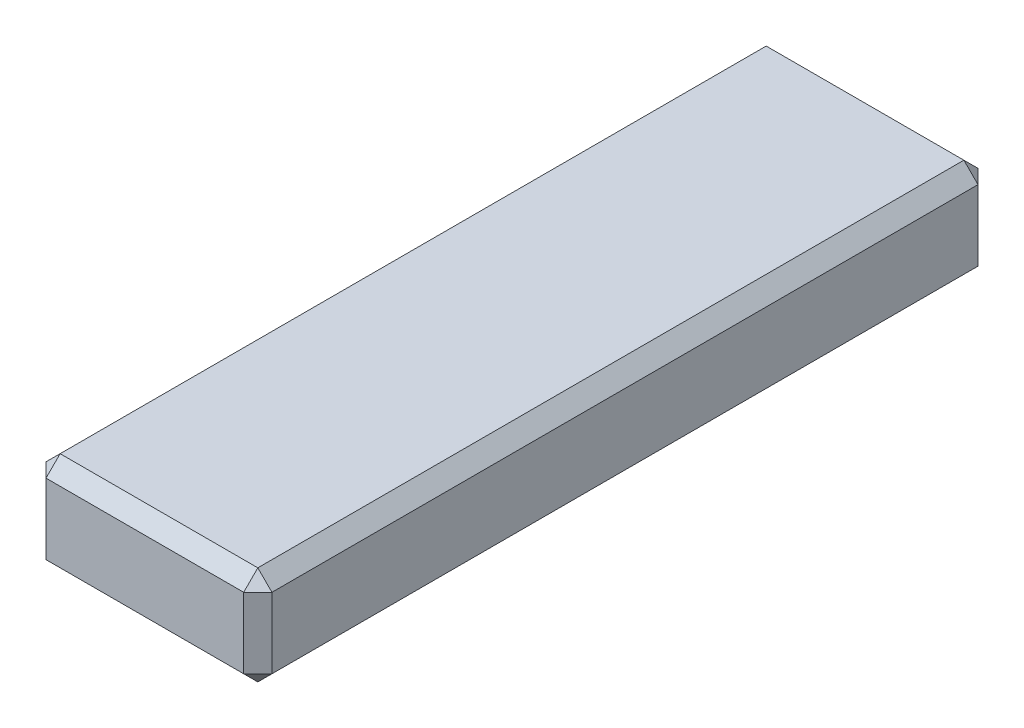
ISO-10303-21;
HEADER;
FILE_DESCRIPTION(('STEP AP214'),'2;1');
FILE_NAME('part.step','',(''),(''),'','','');
FILE_SCHEMA(('AUTOMOTIVE_DESIGN { 1 0 10303 214 1 1 1 1 }'));
ENDSEC;
DATA;
#1=APPLICATION_CONTEXT('core data for automotive mechanical design processes');
#2=APPLICATION_PROTOCOL_DEFINITION('international standard','automotive_design',2000,#1);
#3=PRODUCT_CONTEXT('',#1,'mechanical');
#4=PRODUCT('Part','Part','',(#3));
#5=PRODUCT_RELATED_PRODUCT_CATEGORY('part','',(#4));
#6=PRODUCT_DEFINITION_FORMATION('','',#4);
#7=PRODUCT_DEFINITION_CONTEXT('part definition',#1,'design');
#8=PRODUCT_DEFINITION('design','',#6,#7);
#9=PRODUCT_DEFINITION_SHAPE('','',#8);
#10=(LENGTH_UNIT() NAMED_UNIT(*) SI_UNIT(.MILLI.,.METRE.));
#11=(NAMED_UNIT(*) PLANE_ANGLE_UNIT() SI_UNIT($,.RADIAN.));
#12=(NAMED_UNIT(*) SI_UNIT($,.STERADIAN.) SOLID_ANGLE_UNIT());
#13=UNCERTAINTY_MEASURE_WITH_UNIT(LENGTH_MEASURE(1.E-05),#10,'distance_accuracy_value','');
#14=(GEOMETRIC_REPRESENTATION_CONTEXT(3) GLOBAL_UNCERTAINTY_ASSIGNED_CONTEXT((#13)) GLOBAL_UNIT_ASSIGNED_CONTEXT((#10,
#11,#12)) REPRESENTATION_CONTEXT('',''));
#15=CARTESIAN_POINT('',(0.,0.,0.));
#16=DIRECTION('',(0.,0.,1.));
#17=DIRECTION('',(1.,0.,0.));
#18=AXIS2_PLACEMENT_3D('',#15,#16,#17);
#19=CARTESIAN_POINT('',(4.,1.75,5.));
#20=DIRECTION('',(-1.,0.,0.));
#21=DIRECTION('',(0.,0.,1.));
#22=AXIS2_PLACEMENT_3D('',#19,#20,#21);
#23=PLANE('',#22);
#24=DIRECTION('',(0.,1.,0.));
#25=VECTOR('',#24,1.);
#26=CARTESIAN_POINT('',(4.,1.75,-12.5));
#27=LINE('',#26,#25);
#28=CARTESIAN_POINT('',(4.,-1.25,-12.5));
#29=VERTEX_POINT('',#28);
#30=CARTESIAN_POINT('',(4.,1.25,-12.5));
#31=VERTEX_POINT('',#30);
#32=EDGE_CURVE('E162',#29,#31,#27,.T.);
#33=ORIENTED_EDGE('',*,*,#32,.T.);
#34=DIRECTION('',(0.,0.,1.));
#35=VECTOR('',#34,1.);
#36=CARTESIAN_POINT('',(4.,1.25,5.));
#37=LINE('',#36,#35);
#38=CARTESIAN_POINT('',(4.,1.25,12.5));
#39=VERTEX_POINT('',#38);
#40=EDGE_CURVE('E165',#31,#39,#37,.T.);
#41=ORIENTED_EDGE('',*,*,#40,.T.);
#42=DIRECTION('',(0.,-1.,0.));
#43=VECTOR('',#42,1.);
#44=CARTESIAN_POINT('',(4.,-1.75,12.5));
#45=LINE('',#44,#43);
#46=CARTESIAN_POINT('',(4.,-1.25,12.5));
#47=VERTEX_POINT('',#46);
#48=EDGE_CURVE('E138',#39,#47,#45,.T.);
#49=ORIENTED_EDGE('',*,*,#48,.T.);
#50=DIRECTION('',(0.,0.,-1.));
#51=VECTOR('',#50,1.);
#52=CARTESIAN_POINT('',(4.,-1.25,5.));
#53=LINE('',#52,#51);
#54=EDGE_CURVE('E156',#47,#29,#53,.T.);
#55=ORIENTED_EDGE('',*,*,#54,.T.);
#56=EDGE_LOOP('',(#33,#41,#49,#55));
#57=FACE_BOUND('',#56,.T.);
#58=ADVANCED_FACE('F43',(#57),#23,.F.);
#59=CARTESIAN_POINT('',(-4.,1.75,5.));
#60=DIRECTION('',(0.,-1.,0.));
#61=DIRECTION('',(0.,0.,-1.));
#62=AXIS2_PLACEMENT_3D('',#59,#60,#61);
#63=PLANE('',#62);
#64=DIRECTION('',(0.,0.,1.));
#65=VECTOR('',#64,1.);
#66=CARTESIAN_POINT('',(-3.49999999999999,1.75,5.));
#67=LINE('',#66,#65);
#68=CARTESIAN_POINT('',(-3.49999999999999,1.75,-12.5));
#69=VERTEX_POINT('',#68);
#70=CARTESIAN_POINT('',(-3.49999999999999,1.75,12.5));
#71=VERTEX_POINT('',#70);
#72=EDGE_CURVE('E187',#69,#71,#67,.T.);
#73=ORIENTED_EDGE('',*,*,#72,.T.);
#74=DIRECTION('',(1.,0.,0.));
#75=VECTOR('',#74,1.);
#76=CARTESIAN_POINT('',(4.,1.75,12.5));
#77=LINE('',#76,#75);
#78=CARTESIAN_POINT('',(3.49999999999999,1.75,12.5));
#79=VERTEX_POINT('',#78);
#80=EDGE_CURVE('E193',#71,#79,#77,.T.);
#81=ORIENTED_EDGE('',*,*,#80,.T.);
#82=DIRECTION('',(0.,0.,-1.));
#83=VECTOR('',#82,1.);
#84=CARTESIAN_POINT('',(3.49999999999999,1.75,5.));
#85=LINE('',#84,#83);
#86=CARTESIAN_POINT('',(3.49999999999999,1.75,-12.5));
#87=VERTEX_POINT('',#86);
#88=EDGE_CURVE('E191',#79,#87,#85,.T.);
#89=ORIENTED_EDGE('',*,*,#88,.T.);
#90=DIRECTION('',(-1.,0.,0.));
#91=VECTOR('',#90,1.);
#92=CARTESIAN_POINT('',(-4.,1.75,-12.5));
#93=LINE('',#92,#91);
#94=EDGE_CURVE('E189',#87,#69,#93,.T.);
#95=ORIENTED_EDGE('',*,*,#94,.T.);
#96=EDGE_LOOP('',(#73,#81,#89,#95));
#97=FACE_BOUND('',#96,.T.);
#98=ADVANCED_FACE('F278',(#97),#63,.F.);
#99=CARTESIAN_POINT('',(-4.,1.75,5.));
#100=DIRECTION('',(1.,0.,0.));
#101=DIRECTION('',(0.,0.,-1.));
#102=AXIS2_PLACEMENT_3D('',#99,#100,#101);
#103=PLANE('',#102);
#104=DIRECTION('',(0.,0.,1.));
#105=VECTOR('',#104,1.);
#106=CARTESIAN_POINT('',(-4.,-1.25,5.));
#107=LINE('',#106,#105);
#108=CARTESIAN_POINT('',(-4.,-1.25,-12.5));
#109=VERTEX_POINT('',#108);
#110=CARTESIAN_POINT('',(-4.,-1.25,12.5));
#111=VERTEX_POINT('',#110);
#112=EDGE_CURVE('E53',#109,#111,#107,.T.);
#113=ORIENTED_EDGE('',*,*,#112,.T.);
#114=DIRECTION('',(0.,1.,0.));
#115=VECTOR('',#114,1.);
#116=CARTESIAN_POINT('',(-4.,1.75,12.5));
#117=LINE('',#116,#115);
#118=CARTESIAN_POINT('',(-4.,1.25,12.5));
#119=VERTEX_POINT('',#118);
#120=EDGE_CURVE('E11',#111,#119,#117,.T.);
#121=ORIENTED_EDGE('',*,*,#120,.T.);
#122=DIRECTION('',(0.,0.,-1.));
#123=VECTOR('',#122,1.);
#124=CARTESIAN_POINT('',(-4.,1.25,5.));
#125=LINE('',#124,#123);
#126=CARTESIAN_POINT('',(-4.,1.25,-12.5));
#127=VERTEX_POINT('',#126);
#128=EDGE_CURVE('E205',#119,#127,#125,.T.);
#129=ORIENTED_EDGE('',*,*,#128,.T.);
#130=DIRECTION('',(0.,-1.,0.));
#131=VECTOR('',#130,1.);
#132=CARTESIAN_POINT('',(-4.,-1.75,-12.5));
#133=LINE('',#132,#131);
#134=EDGE_CURVE('E64',#127,#109,#133,.T.);
#135=ORIENTED_EDGE('',*,*,#134,.T.);
#136=EDGE_LOOP('',(#113,#121,#129,#135));
#137=FACE_BOUND('',#136,.T.);
#138=ADVANCED_FACE('F313',(#137),#103,.F.);
#139=CARTESIAN_POINT('',(-4.,-1.75,5.));
#140=DIRECTION('',(0.,1.,0.));
#141=DIRECTION('',(0.,0.,1.));
#142=AXIS2_PLACEMENT_3D('',#139,#140,#141);
#143=PLANE('',#142);
#144=DIRECTION('',(0.,0.,1.));
#145=VECTOR('',#144,1.);
#146=CARTESIAN_POINT('',(3.49999999999999,-1.75,5.));
#147=LINE('',#146,#145);
#148=CARTESIAN_POINT('',(3.49999999999999,-1.75,-12.5));
#149=VERTEX_POINT('',#148);
#150=CARTESIAN_POINT('',(3.49999999999999,-1.75,12.5));
#151=VERTEX_POINT('',#150);
#152=EDGE_CURVE('E200',#149,#151,#147,.T.);
#153=ORIENTED_EDGE('',*,*,#152,.T.);
#154=DIRECTION('',(-1.,0.,0.));
#155=VECTOR('',#154,1.);
#156=CARTESIAN_POINT('',(-4.,-1.75,12.5));
#157=LINE('',#156,#155);
#158=CARTESIAN_POINT('',(-3.49999999999999,-1.75,12.5));
#159=VERTEX_POINT('',#158);
#160=EDGE_CURVE('E202',#151,#159,#157,.T.);
#161=ORIENTED_EDGE('',*,*,#160,.T.);
#162=DIRECTION('',(0.,0.,-1.));
#163=VECTOR('',#162,1.);
#164=CARTESIAN_POINT('',(-3.49999999999999,-1.75,5.));
#165=LINE('',#164,#163);
#166=CARTESIAN_POINT('',(-3.49999999999999,-1.75,-12.5));
#167=VERTEX_POINT('',#166);
#168=EDGE_CURVE('E196',#159,#167,#165,.T.);
#169=ORIENTED_EDGE('',*,*,#168,.T.);
#170=DIRECTION('',(1.,0.,0.));
#171=VECTOR('',#170,1.);
#172=CARTESIAN_POINT('',(4.,-1.75,-12.5));
#173=LINE('',#172,#171);
#174=EDGE_CURVE('E198',#167,#149,#173,.T.);
#175=ORIENTED_EDGE('',*,*,#174,.T.);
#176=EDGE_LOOP('',(#153,#161,#169,#175));
#177=FACE_BOUND('',#176,.T.);
#178=ADVANCED_FACE('F315',(#177),#143,.F.);
#179=CARTESIAN_POINT('',(0.,0.,-13.));
#180=DIRECTION('',(0.,0.,-1.));
#181=DIRECTION('',(-1.,0.,0.));
#182=AXIS2_PLACEMENT_3D('',#179,#180,#181);
#183=PLANE('',#182);
#184=DIRECTION('',(1.,0.,0.));
#185=VECTOR('',#184,1.);
#186=CARTESIAN_POINT('',(4.,1.25,-13.));
#187=LINE('',#186,#185);
#188=CARTESIAN_POINT('',(-3.49999999999999,1.25,-13.));
#189=VERTEX_POINT('',#188);
#190=CARTESIAN_POINT('',(3.5,1.25,-13.));
#191=VERTEX_POINT('',#190);
#192=EDGE_CURVE('E182',#189,#191,#187,.T.);
#193=ORIENTED_EDGE('',*,*,#192,.T.);
#194=DIRECTION('',(0.,-1.,0.));
#195=VECTOR('',#194,1.);
#196=CARTESIAN_POINT('',(3.5,-1.75,-13.));
#197=LINE('',#196,#195);
#198=CARTESIAN_POINT('',(3.5,-1.25,-13.));
#199=VERTEX_POINT('',#198);
#200=EDGE_CURVE('E184',#191,#199,#197,.T.);
#201=ORIENTED_EDGE('',*,*,#200,.T.);
#202=DIRECTION('',(-1.,0.,0.));
#203=VECTOR('',#202,1.);
#204=CARTESIAN_POINT('',(-4.,-1.25,-13.));
#205=LINE('',#204,#203);
#206=CARTESIAN_POINT('',(-3.49999999999999,-1.25,-13.));
#207=VERTEX_POINT('',#206);
#208=EDGE_CURVE('E180',#199,#207,#205,.T.);
#209=ORIENTED_EDGE('',*,*,#208,.T.);
#210=DIRECTION('',(0.,1.,0.));
#211=VECTOR('',#210,1.);
#212=CARTESIAN_POINT('',(-3.49999999999999,1.75,-13.));
#213=LINE('',#212,#211);
#214=EDGE_CURVE('E178',#207,#189,#213,.T.);
#215=ORIENTED_EDGE('',*,*,#214,.T.);
#216=EDGE_LOOP('',(#193,#201,#209,#215));
#217=FACE_BOUND('',#216,.T.);
#218=ADVANCED_FACE('F287',(#217),#183,.T.);
#219=CARTESIAN_POINT('',(0.,0.,13.));
#220=DIRECTION('',(0.,0.,1.));
#221=DIRECTION('',(-1.,0.,0.));
#222=AXIS2_PLACEMENT_3D('',#219,#220,#221);
#223=PLANE('',#222);
#224=DIRECTION('',(1.,0.,0.));
#225=VECTOR('',#224,1.);
#226=CARTESIAN_POINT('',(4.,-1.24999999999999,13.));
#227=LINE('',#226,#225);
#228=CARTESIAN_POINT('',(-3.49999999999999,-1.24999999999999,13.));
#229=VERTEX_POINT('',#228);
#230=CARTESIAN_POINT('',(3.49999999999999,-1.24999999999999,13.));
#231=VERTEX_POINT('',#230);
#232=EDGE_CURVE('E173',#229,#231,#227,.T.);
#233=ORIENTED_EDGE('',*,*,#232,.T.);
#234=DIRECTION('',(0.,1.,0.));
#235=VECTOR('',#234,1.);
#236=CARTESIAN_POINT('',(3.49999999999999,1.75,13.));
#237=LINE('',#236,#235);
#238=CARTESIAN_POINT('',(3.49999999999999,1.25,13.));
#239=VERTEX_POINT('',#238);
#240=EDGE_CURVE('E140',#231,#239,#237,.T.);
#241=ORIENTED_EDGE('',*,*,#240,.T.);
#242=DIRECTION('',(-1.,0.,0.));
#243=VECTOR('',#242,1.);
#244=CARTESIAN_POINT('',(-4.,1.25,13.));
#245=LINE('',#244,#243);
#246=CARTESIAN_POINT('',(-3.49999999999999,1.25,13.));
#247=VERTEX_POINT('',#246);
#248=EDGE_CURVE('E175',#239,#247,#245,.T.);
#249=ORIENTED_EDGE('',*,*,#248,.T.);
#250=DIRECTION('',(0.,-1.,0.));
#251=VECTOR('',#250,1.);
#252=CARTESIAN_POINT('',(-3.49999999999999,-1.75,13.));
#253=LINE('',#252,#251);
#254=EDGE_CURVE('E168',#247,#229,#253,.T.);
#255=ORIENTED_EDGE('',*,*,#254,.T.);
#256=EDGE_LOOP('',(#233,#241,#249,#255));
#257=FACE_BOUND('',#256,.T.);
#258=ADVANCED_FACE('F438',(#257),#223,.T.);
#259=CARTESIAN_POINT('',(-3.49999999999999,0.,-13.));
#260=DIRECTION('',(-0.707106781186545,0.,-0.70710678118655));
#261=DIRECTION('',(0.,-1.,0.));
#262=AXIS2_PLACEMENT_3D('',#259,#260,#261);
#263=PLANE('',#262);
#264=DIRECTION('',(-0.70710678118655,0.,0.707106781186545));
#265=VECTOR('',#264,1.);
#266=CARTESIAN_POINT('',(-3.75,1.25,-12.75));
#267=LINE('',#266,#265);
#268=EDGE_CURVE('E48',#189,#127,#267,.T.);
#269=ORIENTED_EDGE('',*,*,#268,.F.);
#270=ORIENTED_EDGE('',*,*,#214,.F.);
#271=DIRECTION('',(0.70710678118655,0.,-0.707106781186545));
#272=VECTOR('',#271,1.);
#273=CARTESIAN_POINT('',(-3.49999999999999,-1.25,-13.));
#274=LINE('',#273,#272);
#275=EDGE_CURVE('E257',#109,#207,#274,.T.);
#276=ORIENTED_EDGE('',*,*,#275,.F.);
#277=ORIENTED_EDGE('',*,*,#134,.F.);
#278=EDGE_LOOP('',(#269,#270,#276,#277));
#279=FACE_BOUND('',#278,.T.);
#280=ADVANCED_FACE('F46',(#279),#263,.T.);
#281=CARTESIAN_POINT('',(-3.49999999999999,1.75,-12.5));
#282=DIRECTION('',(-0.577350269189622,0.57735026918963,-0.577350269189626));
#283=DIRECTION('',(0.,0.707106781186545,0.70710678118655));
#284=AXIS2_PLACEMENT_3D('',#281,#282,#283);
#285=PLANE('',#284);
#286=DIRECTION('',(0.,-0.707106781186545,-0.70710678118655));
#287=VECTOR('',#286,1.);
#288=CARTESIAN_POINT('',(-3.49999999999999,1.75,-12.5));
#289=LINE('',#288,#287);
#290=EDGE_CURVE('E252',#189,#69,#289,.F.);
#291=ORIENTED_EDGE('',*,*,#290,.F.);
#292=ORIENTED_EDGE('',*,*,#268,.T.);
#293=DIRECTION('',(-0.70710678118655,-0.707106781186545,0.));
#294=VECTOR('',#293,1.);
#295=CARTESIAN_POINT('',(-3.49999999999999,1.75,-12.5));
#296=LINE('',#295,#294);
#297=EDGE_CURVE('E255',#69,#127,#296,.T.);
#298=ORIENTED_EDGE('',*,*,#297,.F.);
#299=EDGE_LOOP('',(#291,#292,#298));
#300=FACE_BOUND('',#299,.T.);
#301=ADVANCED_FACE('F267',(#300),#285,.T.);
#302=CARTESIAN_POINT('',(-3.49999999999999,-1.25,-13.));
#303=DIRECTION('',(-0.577350269189622,-0.57735026918963,-0.577350269189626));
#304=DIRECTION('',(0.,0.707106781186545,-0.70710678118655));
#305=AXIS2_PLACEMENT_3D('',#302,#303,#304);
#306=PLANE('',#305);
#307=DIRECTION('',(0.70710678118655,-0.707106781186545,0.));
#308=VECTOR('',#307,1.);
#309=CARTESIAN_POINT('',(-3.75,-1.5,-12.5));
#310=LINE('',#309,#308);
#311=EDGE_CURVE('E246',#109,#167,#310,.T.);
#312=ORIENTED_EDGE('',*,*,#311,.F.);
#313=ORIENTED_EDGE('',*,*,#275,.T.);
#314=DIRECTION('',(0.,-0.707106781186545,0.70710678118655));
#315=VECTOR('',#314,1.);
#316=CARTESIAN_POINT('',(-3.49999999999999,-1.25,-13.));
#317=LINE('',#316,#315);
#318=EDGE_CURVE('E249',#167,#207,#317,.F.);
#319=ORIENTED_EDGE('',*,*,#318,.F.);
#320=EDGE_LOOP('',(#312,#313,#319));
#321=FACE_BOUND('',#320,.T.);
#322=ADVANCED_FACE('F299',(#321),#306,.T.);
#323=CARTESIAN_POINT('',(-4.,1.25,5.));
#324=DIRECTION('',(0.707106781186545,-0.70710678118655,0.));
#325=DIRECTION('',(0.,0.,-1.));
#326=AXIS2_PLACEMENT_3D('',#323,#324,#325);
#327=PLANE('',#326);
#328=ORIENTED_EDGE('',*,*,#297,.T.);
#329=ORIENTED_EDGE('',*,*,#128,.F.);
#330=DIRECTION('',(0.70710678118655,0.707106781186545,0.));
#331=VECTOR('',#330,1.);
#332=CARTESIAN_POINT('',(-3.75,1.5,12.5));
#333=LINE('',#332,#331);
#334=EDGE_CURVE('E241',#71,#119,#333,.F.);
#335=ORIENTED_EDGE('',*,*,#334,.F.);
#336=ORIENTED_EDGE('',*,*,#72,.F.);
#337=EDGE_LOOP('',(#328,#329,#335,#336));
#338=FACE_BOUND('',#337,.T.);
#339=ADVANCED_FACE('F274',(#338),#327,.F.);
#340=CARTESIAN_POINT('',(0.,1.25,-13.));
#341=DIRECTION('',(0.,0.70710678118655,-0.707106781186545));
#342=DIRECTION('',(-1.,0.,0.));
#343=AXIS2_PLACEMENT_3D('',#340,#341,#342);
#344=PLANE('',#343);
#345=ORIENTED_EDGE('',*,*,#290,.T.);
#346=ORIENTED_EDGE('',*,*,#94,.F.);
#347=DIRECTION('',(0.,0.707106781186545,0.70710678118655));
#348=VECTOR('',#347,1.);
#349=CARTESIAN_POINT('',(3.49999999999999,1.5,-12.75));
#350=LINE('',#349,#348);
#351=EDGE_CURVE('E238',#191,#87,#350,.T.);
#352=ORIENTED_EDGE('',*,*,#351,.F.);
#353=ORIENTED_EDGE('',*,*,#192,.F.);
#354=EDGE_LOOP('',(#345,#346,#352,#353));
#355=FACE_BOUND('',#354,.T.);
#356=ADVANCED_FACE('F284',(#355),#344,.T.);
#357=CARTESIAN_POINT('',(3.5,0.,-13.));
#358=DIRECTION('',(0.70710678118655,0.,-0.707106781186545));
#359=DIRECTION('',(0.,1.,0.));
#360=AXIS2_PLACEMENT_3D('',#357,#358,#359);
#361=PLANE('',#360);
#362=DIRECTION('',(0.707106781186545,0.,0.70710678118655));
#363=VECTOR('',#362,1.);
#364=CARTESIAN_POINT('',(3.5,-1.25,-13.));
#365=LINE('',#364,#363);
#366=EDGE_CURVE('E232',#199,#29,#365,.T.);
#367=ORIENTED_EDGE('',*,*,#366,.F.);
#368=ORIENTED_EDGE('',*,*,#200,.F.);
#369=DIRECTION('',(-0.707106781186545,0.,-0.70710678118655));
#370=VECTOR('',#369,1.);
#371=CARTESIAN_POINT('',(4.,1.25,-12.5));
#372=LINE('',#371,#370);
#373=EDGE_CURVE('E235',#31,#191,#372,.T.);
#374=ORIENTED_EDGE('',*,*,#373,.F.);
#375=ORIENTED_EDGE('',*,*,#32,.F.);
#376=EDGE_LOOP('',(#367,#368,#374,#375));
#377=FACE_BOUND('',#376,.T.);
#378=ADVANCED_FACE('F291',(#377),#361,.T.);
#379=CARTESIAN_POINT('',(0.,-1.25,-13.));
#380=DIRECTION('',(0.,-0.70710678118655,-0.707106781186545));
#381=DIRECTION('',(1.,0.,0.));
#382=AXIS2_PLACEMENT_3D('',#379,#380,#381);
#383=PLANE('',#382);
#384=ORIENTED_EDGE('',*,*,#318,.T.);
#385=ORIENTED_EDGE('',*,*,#208,.F.);
#386=DIRECTION('',(0.,0.707106781186545,-0.70710678118655));
#387=VECTOR('',#386,1.);
#388=CARTESIAN_POINT('',(3.5,-1.25,-13.));
#389=LINE('',#388,#387);
#390=EDGE_CURVE('E230',#149,#199,#389,.T.);
#391=ORIENTED_EDGE('',*,*,#390,.F.);
#392=ORIENTED_EDGE('',*,*,#174,.F.);
#393=EDGE_LOOP('',(#384,#385,#391,#392));
#394=FACE_BOUND('',#393,.T.);
#395=ADVANCED_FACE('F297',(#394),#383,.T.);
#396=CARTESIAN_POINT('',(-3.49999999999999,-1.75,5.));
#397=DIRECTION('',(0.707106781186545,0.70710678118655,0.));
#398=DIRECTION('',(0.,0.,-1.));
#399=AXIS2_PLACEMENT_3D('',#396,#397,#398);
#400=PLANE('',#399);
#401=ORIENTED_EDGE('',*,*,#311,.T.);
#402=ORIENTED_EDGE('',*,*,#168,.F.);
#403=DIRECTION('',(-0.70710678118655,0.707106781186545,0.));
#404=VECTOR('',#403,1.);
#405=CARTESIAN_POINT('',(-3.49999999999999,-1.75,12.5));
#406=LINE('',#405,#404);
#407=EDGE_CURVE('E227',#111,#159,#406,.F.);
#408=ORIENTED_EDGE('',*,*,#407,.F.);
#409=ORIENTED_EDGE('',*,*,#112,.F.);
#410=EDGE_LOOP('',(#401,#402,#408,#409));
#411=FACE_BOUND('',#410,.T.);
#412=ADVANCED_FACE('F303',(#411),#400,.F.);
#413=CARTESIAN_POINT('',(-4.,1.75,12.5));
#414=DIRECTION('',(-0.707106781186545,0.,0.70710678118655));
#415=DIRECTION('',(0.,-1.,0.));
#416=AXIS2_PLACEMENT_3D('',#413,#414,#415);
#417=PLANE('',#416);
#418=DIRECTION('',(0.70710678118655,0.,0.707106781186545));
#419=VECTOR('',#418,1.);
#420=CARTESIAN_POINT('',(-3.49999999999999,1.25,13.));
#421=LINE('',#420,#419);
#422=EDGE_CURVE('E243',#119,#247,#421,.T.);
#423=ORIENTED_EDGE('',*,*,#422,.F.);
#424=ORIENTED_EDGE('',*,*,#120,.F.);
#425=DIRECTION('',(-0.70710678118655,0.,-0.707106781186545));
#426=VECTOR('',#425,1.);
#427=CARTESIAN_POINT('',(-3.75,-1.24999999999999,12.75));
#428=LINE('',#427,#426);
#429=EDGE_CURVE('E224',#229,#111,#428,.T.);
#430=ORIENTED_EDGE('',*,*,#429,.F.);
#431=ORIENTED_EDGE('',*,*,#254,.F.);
#432=EDGE_LOOP('',(#423,#424,#430,#431));
#433=FACE_BOUND('',#432,.T.);
#434=ADVANCED_FACE('F312',(#433),#417,.T.);
#435=CARTESIAN_POINT('',(-3.49999999999999,1.25,13.));
#436=DIRECTION('',(-0.577350269189622,0.57735026918963,0.577350269189626));
#437=DIRECTION('',(0.,-0.707106781186545,0.70710678118655));
#438=AXIS2_PLACEMENT_3D('',#435,#436,#437);
#439=PLANE('',#438);
#440=ORIENTED_EDGE('',*,*,#334,.T.);
#441=ORIENTED_EDGE('',*,*,#422,.T.);
#442=DIRECTION('',(0.,0.707106781186545,-0.70710678118655));
#443=VECTOR('',#442,1.);
#444=CARTESIAN_POINT('',(-3.49999999999999,1.25,13.));
#445=LINE('',#444,#443);
#446=EDGE_CURVE('E221',#71,#247,#445,.F.);
#447=ORIENTED_EDGE('',*,*,#446,.F.);
#448=EDGE_LOOP('',(#440,#441,#447));
#449=FACE_BOUND('',#448,.T.);
#450=ADVANCED_FACE('F390',(#449),#439,.T.);
#451=CARTESIAN_POINT('',(4.,1.25,-12.5));
#452=DIRECTION('',(0.577350269189626,0.57735026918963,-0.577350269189622));
#453=DIRECTION('',(-0.70710678118655,0.707106781186545,0.));
#454=AXIS2_PLACEMENT_3D('',#451,#452,#453);
#455=PLANE('',#454);
#456=ORIENTED_EDGE('',*,*,#373,.T.);
#457=ORIENTED_EDGE('',*,*,#351,.T.);
#458=DIRECTION('',(-0.70710678118655,0.707106781186545,0.));
#459=VECTOR('',#458,1.);
#460=CARTESIAN_POINT('',(4.,1.25,-12.5));
#461=LINE('',#460,#459);
#462=EDGE_CURVE('E218',#31,#87,#461,.T.);
#463=ORIENTED_EDGE('',*,*,#462,.F.);
#464=EDGE_LOOP('',(#456,#457,#463));
#465=FACE_BOUND('',#464,.T.);
#466=ADVANCED_FACE('F384',(#465),#455,.T.);
#467=CARTESIAN_POINT('',(3.5,-1.25,-13.));
#468=DIRECTION('',(0.577350269189626,-0.57735026918963,-0.577350269189622));
#469=DIRECTION('',(0.70710678118655,0.707106781186545,0.));
#470=AXIS2_PLACEMENT_3D('',#467,#468,#469);
#471=PLANE('',#470);
#472=ORIENTED_EDGE('',*,*,#390,.T.);
#473=ORIENTED_EDGE('',*,*,#366,.T.);
#474=DIRECTION('',(0.70710678118655,0.707106781186545,0.));
#475=VECTOR('',#474,1.);
#476=CARTESIAN_POINT('',(3.75,-1.5,-12.5));
#477=LINE('',#476,#475);
#478=EDGE_CURVE('E159',#149,#29,#477,.T.);
#479=ORIENTED_EDGE('',*,*,#478,.F.);
#480=EDGE_LOOP('',(#472,#473,#479));
#481=FACE_BOUND('',#480,.T.);
#482=ADVANCED_FACE('F378',(#481),#471,.T.);
#483=CARTESIAN_POINT('',(-3.49999999999999,-1.75,12.5));
#484=DIRECTION('',(-0.577350269189622,-0.577350269189626,0.57735026918963));
#485=DIRECTION('',(0.,-0.70710678118655,-0.707106781186545));
#486=AXIS2_PLACEMENT_3D('',#483,#484,#485);
#487=PLANE('',#486);
#488=ORIENTED_EDGE('',*,*,#429,.T.);
#489=ORIENTED_EDGE('',*,*,#407,.T.);
#490=DIRECTION('',(0.,0.70710678118655,0.707106781186545));
#491=VECTOR('',#490,1.);
#492=CARTESIAN_POINT('',(-3.49999999999999,-1.75,12.5));
#493=LINE('',#492,#491);
#494=EDGE_CURVE('E215',#229,#159,#493,.F.);
#495=ORIENTED_EDGE('',*,*,#494,.F.);
#496=EDGE_LOOP('',(#488,#489,#495));
#497=FACE_BOUND('',#496,.T.);
#498=ADVANCED_FACE('F307',(#497),#487,.T.);
#499=CARTESIAN_POINT('',(-4.,1.75,12.5));
#500=DIRECTION('',(0.,0.70710678118655,0.707106781186545));
#501=DIRECTION('',(-1.,0.,0.));
#502=AXIS2_PLACEMENT_3D('',#499,#500,#501);
#503=PLANE('',#502);
#504=ORIENTED_EDGE('',*,*,#446,.T.);
#505=ORIENTED_EDGE('',*,*,#248,.F.);
#506=DIRECTION('',(0.,-0.707106781186545,0.70710678118655));
#507=VECTOR('',#506,1.);
#508=CARTESIAN_POINT('',(3.49999999999999,1.25,13.));
#509=LINE('',#508,#507);
#510=EDGE_CURVE('E212',#79,#239,#509,.T.);
#511=ORIENTED_EDGE('',*,*,#510,.F.);
#512=ORIENTED_EDGE('',*,*,#80,.F.);
#513=EDGE_LOOP('',(#504,#505,#511,#512));
#514=FACE_BOUND('',#513,.T.);
#515=ADVANCED_FACE('F365',(#514),#503,.T.);
#516=CARTESIAN_POINT('',(3.49999999999999,1.75,5.));
#517=DIRECTION('',(-0.707106781186545,-0.70710678118655,0.));
#518=DIRECTION('',(0.,0.,-1.));
#519=AXIS2_PLACEMENT_3D('',#516,#517,#518);
#520=PLANE('',#519);
#521=ORIENTED_EDGE('',*,*,#462,.T.);
#522=ORIENTED_EDGE('',*,*,#88,.F.);
#523=DIRECTION('',(0.70710678118655,-0.707106781186545,0.));
#524=VECTOR('',#523,1.);
#525=CARTESIAN_POINT('',(3.75,1.5,12.5));
#526=LINE('',#525,#524);
#527=EDGE_CURVE('E153',#39,#79,#526,.F.);
#528=ORIENTED_EDGE('',*,*,#527,.F.);
#529=ORIENTED_EDGE('',*,*,#40,.F.);
#530=EDGE_LOOP('',(#521,#522,#528,#529));
#531=FACE_BOUND('',#530,.T.);
#532=ADVANCED_FACE('F359',(#531),#520,.F.);
#533=CARTESIAN_POINT('',(4.,-1.25,5.));
#534=DIRECTION('',(-0.707106781186545,0.70710678118655,0.));
#535=DIRECTION('',(0.,0.,-1.));
#536=AXIS2_PLACEMENT_3D('',#533,#534,#535);
#537=PLANE('',#536);
#538=ORIENTED_EDGE('',*,*,#478,.T.);
#539=ORIENTED_EDGE('',*,*,#54,.F.);
#540=DIRECTION('',(-0.70710678118655,-0.707106781186545,0.));
#541=VECTOR('',#540,1.);
#542=CARTESIAN_POINT('',(4.,-1.25,12.5));
#543=LINE('',#542,#541);
#544=EDGE_CURVE('E146',#151,#47,#543,.F.);
#545=ORIENTED_EDGE('',*,*,#544,.F.);
#546=ORIENTED_EDGE('',*,*,#152,.F.);
#547=EDGE_LOOP('',(#538,#539,#545,#546));
#548=FACE_BOUND('',#547,.T.);
#549=ADVANCED_FACE('F157',(#548),#537,.F.);
#550=CARTESIAN_POINT('',(-4.,-1.75,12.5));
#551=DIRECTION('',(0.,-0.707106781186545,0.70710678118655));
#552=DIRECTION('',(1.,0.,0.));
#553=AXIS2_PLACEMENT_3D('',#550,#551,#552);
#554=PLANE('',#553);
#555=ORIENTED_EDGE('',*,*,#494,.T.);
#556=ORIENTED_EDGE('',*,*,#160,.F.);
#557=DIRECTION('',(0.,-0.70710678118655,-0.707106781186545));
#558=VECTOR('',#557,1.);
#559=CARTESIAN_POINT('',(3.49999999999999,-1.5,12.75));
#560=LINE('',#559,#558);
#561=EDGE_CURVE('E150',#231,#151,#560,.T.);
#562=ORIENTED_EDGE('',*,*,#561,.F.);
#563=ORIENTED_EDGE('',*,*,#232,.F.);
#564=EDGE_LOOP('',(#555,#556,#562,#563));
#565=FACE_BOUND('',#564,.T.);
#566=ADVANCED_FACE('F346',(#565),#554,.T.);
#567=CARTESIAN_POINT('',(3.49999999999999,1.25,13.));
#568=DIRECTION('',(0.577350269189622,0.57735026918963,0.577350269189626));
#569=DIRECTION('',(0.,-0.707106781186545,0.70710678118655));
#570=AXIS2_PLACEMENT_3D('',#567,#568,#569);
#571=PLANE('',#570);
#572=ORIENTED_EDGE('',*,*,#527,.T.);
#573=ORIENTED_EDGE('',*,*,#510,.T.);
#574=DIRECTION('',(0.70710678118655,0.,-0.707106781186545));
#575=VECTOR('',#574,1.);
#576=CARTESIAN_POINT('',(3.49999999999999,1.25,13.));
#577=LINE('',#576,#575);
#578=EDGE_CURVE('E143',#39,#239,#577,.F.);
#579=ORIENTED_EDGE('',*,*,#578,.F.);
#580=EDGE_LOOP('',(#572,#573,#579));
#581=FACE_BOUND('',#580,.T.);
#582=ADVANCED_FACE('F340',(#581),#571,.T.);
#583=CARTESIAN_POINT('',(4.,-1.25,12.5));
#584=DIRECTION('',(0.577350269189622,-0.577350269189626,0.57735026918963));
#585=DIRECTION('',(0.,-0.70710678118655,-0.707106781186545));
#586=AXIS2_PLACEMENT_3D('',#583,#584,#585);
#587=PLANE('',#586);
#588=ORIENTED_EDGE('',*,*,#561,.T.);
#589=ORIENTED_EDGE('',*,*,#544,.T.);
#590=DIRECTION('',(-0.70710678118655,0.,0.707106781186545));
#591=VECTOR('',#590,1.);
#592=CARTESIAN_POINT('',(4.,-1.25,12.5));
#593=LINE('',#592,#591);
#594=EDGE_CURVE('E134',#231,#47,#593,.F.);
#595=ORIENTED_EDGE('',*,*,#594,.F.);
#596=EDGE_LOOP('',(#588,#589,#595));
#597=FACE_BOUND('',#596,.T.);
#598=ADVANCED_FACE('F148',(#597),#587,.T.);
#599=CARTESIAN_POINT('',(4.,1.75,12.5));
#600=DIRECTION('',(0.707106781186545,0.,0.70710678118655));
#601=DIRECTION('',(0.,1.,0.));
#602=AXIS2_PLACEMENT_3D('',#599,#600,#601);
#603=PLANE('',#602);
#604=ORIENTED_EDGE('',*,*,#578,.T.);
#605=ORIENTED_EDGE('',*,*,#240,.F.);
#606=ORIENTED_EDGE('',*,*,#594,.T.);
#607=ORIENTED_EDGE('',*,*,#48,.F.);
#608=EDGE_LOOP('',(#604,#605,#606,#607));
#609=FACE_BOUND('',#608,.T.);
#610=ADVANCED_FACE('F136',(#609),#603,.T.);
#611=CLOSED_SHELL('',(#58,#98,#138,#178,#218,#258,#280,#301,#322,#339,#356,#378,#395,#412,#434,
#450,#466,#482,#498,#515,#532,#549,#566,#582,#598,#610));
#612=MANIFOLD_SOLID_BREP('B2',#611);
#613=ADVANCED_BREP_SHAPE_REPRESENTATION('',(#18,#612),#14);
#614=SHAPE_DEFINITION_REPRESENTATION(#9,#613);
ENDSEC;
END-ISO-10303-21;
